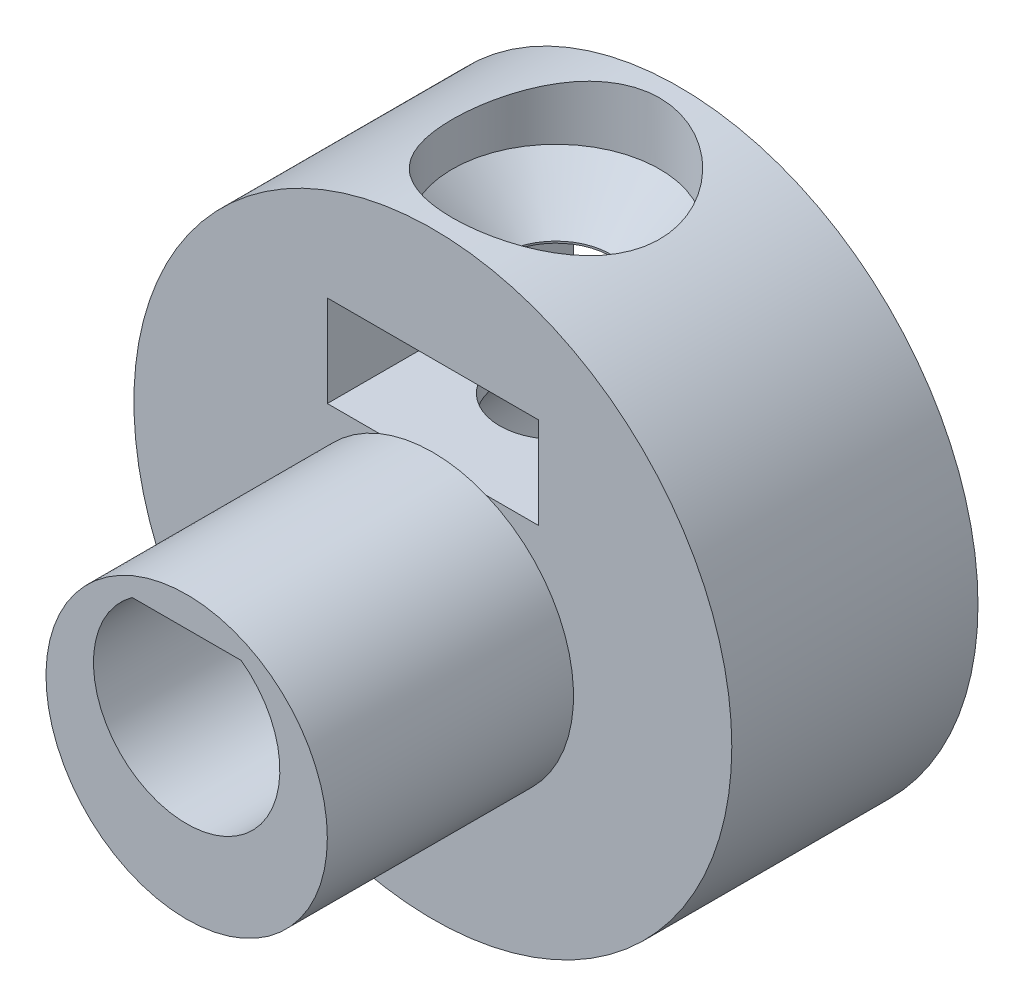
ISO-10303-21;
HEADER;
FILE_DESCRIPTION(('STEP AP214'),'2;1');
FILE_NAME('part.step','',(''),(''),'','','');
FILE_SCHEMA(('AUTOMOTIVE_DESIGN { 1 0 10303 214 1 1 1 1 }'));
ENDSEC;
DATA;
#1=APPLICATION_CONTEXT('core data for automotive mechanical design processes');
#2=APPLICATION_PROTOCOL_DEFINITION('international standard','automotive_design',2000,#1);
#3=PRODUCT_CONTEXT('',#1,'mechanical');
#4=PRODUCT('Part','Part','',(#3));
#5=PRODUCT_RELATED_PRODUCT_CATEGORY('part','',(#4));
#6=PRODUCT_DEFINITION_FORMATION('','',#4);
#7=PRODUCT_DEFINITION_CONTEXT('part definition',#1,'design');
#8=PRODUCT_DEFINITION('design','',#6,#7);
#9=PRODUCT_DEFINITION_SHAPE('','',#8);
#10=(LENGTH_UNIT() NAMED_UNIT(*) SI_UNIT(.MILLI.,.METRE.));
#11=(NAMED_UNIT(*) PLANE_ANGLE_UNIT() SI_UNIT($,.RADIAN.));
#12=(NAMED_UNIT(*) SI_UNIT($,.STERADIAN.) SOLID_ANGLE_UNIT());
#13=UNCERTAINTY_MEASURE_WITH_UNIT(LENGTH_MEASURE(1.E-05),#10,'distance_accuracy_value','');
#14=(GEOMETRIC_REPRESENTATION_CONTEXT(3) GLOBAL_UNCERTAINTY_ASSIGNED_CONTEXT((#13)) GLOBAL_UNIT_ASSIGNED_CONTEXT((#10,
#11,#12)) REPRESENTATION_CONTEXT('',''));
#15=CARTESIAN_POINT('',(0.,0.,0.));
#16=DIRECTION('',(0.,0.,1.));
#17=DIRECTION('',(1.,0.,0.));
#18=AXIS2_PLACEMENT_3D('',#15,#16,#17);
#19=CARTESIAN_POINT('',(0.,0.,7.));
#20=DIRECTION('',(0.,0.,-1.));
#21=DIRECTION('',(-1.,0.,0.));
#22=AXIS2_PLACEMENT_3D('',#19,#20,#21);
#23=CYLINDRICAL_SURFACE('',#22,8.5);
#24=CARTESIAN_POINT('',(0.,0.,7.));
#25=DIRECTION('',(0.,0.,1.));
#26=DIRECTION('',(1.,0.,0.));
#27=AXIS2_PLACEMENT_3D('',#24,#25,#26);
#28=CIRCLE('',#27,8.5);
#29=CARTESIAN_POINT('',(8.5,0.,7.));
#30=VERTEX_POINT('',#29);
#31=EDGE_CURVE('E272',#30,#30,#28,.T.);
#32=ORIENTED_EDGE('',*,*,#31,.F.);
#33=EDGE_LOOP('',(#32));
#34=FACE_BOUND('',#33,.T.);
#35=CARTESIAN_POINT('',(0.,0.,0.));
#36=DIRECTION('',(0.,0.,1.));
#37=DIRECTION('',(1.,0.,0.));
#38=AXIS2_PLACEMENT_3D('',#35,#36,#37);
#39=CIRCLE('',#38,8.5);
#40=CARTESIAN_POINT('',(8.5,0.,0.));
#41=VERTEX_POINT('',#40);
#42=EDGE_CURVE('E266',#41,#41,#39,.T.);
#43=ORIENTED_EDGE('',*,*,#42,.T.);
#44=EDGE_LOOP('',(#43));
#45=FACE_BOUND('',#44,.T.);
#46=CARTESIAN_POINT('',(-2.4976566133076,8.12475916209218,5.06978069869673));
#47=CARTESIAN_POINT('',(-2.45319115247167,8.13842624372445,5.14052214784692));
#48=CARTESIAN_POINT('',(-2.40579379129014,8.15259906685285,5.20926792787036));
#49=CARTESIAN_POINT('',(-2.30541918353998,8.18155142551015,5.34241791198123));
#50=CARTESIAN_POINT('',(-2.25244214730842,8.19633093815584,5.40682227957694));
#51=CARTESIAN_POINT('',(-2.08559993364935,8.24096387551114,5.59296340845329));
#52=CARTESIAN_POINT('',(-1.96379293821466,8.27112157248585,5.70767691704536));
#53=CARTESIAN_POINT('',(-1.70636003995567,8.32797463190604,5.91184711282402));
#54=CARTESIAN_POINT('',(-1.57128592838729,8.35474881482083,6.001981892767));
#55=CARTESIAN_POINT('',(-1.28750137103305,8.40315485018163,6.15915511575892));
#56=CARTESIAN_POINT('',(-1.13879895604352,8.42478970443847,6.22620705151039));
#57=CARTESIAN_POINT('',(-0.831187937836323,8.46068191069057,6.33519131239508));
#58=CARTESIAN_POINT('',(-0.672256571938539,8.47492212101672,6.37706530718806));
#59=CARTESIAN_POINT('',(-0.349104402202425,8.4943684291606,6.43385731899328));
#60=CARTESIAN_POINT('',(-0.184884583871302,8.49957620037078,6.44878032909372));
#61=CARTESIAN_POINT('',(0.138015723993134,8.50036011208845,6.45103621336103));
#62=CARTESIAN_POINT('',(0.296689734672785,8.4962657088658,6.43931282000832));
#63=CARTESIAN_POINT('',(0.609739891194811,8.47955195455849,6.39064304040091));
#64=CARTESIAN_POINT('',(0.764113634581695,8.46692793384153,6.35368283786199));
#65=CARTESIAN_POINT('',(1.06375533887611,8.4345186012922,6.25603150933245));
#66=CARTESIAN_POINT('',(1.20905000683216,8.41475557760322,6.19541419459285));
#67=CARTESIAN_POINT('',(1.48731375058839,8.37004774740902,6.0524065686952));
#68=CARTESIAN_POINT('',(1.62030956781964,8.34511458458429,5.97006507104002));
#69=CARTESIAN_POINT('',(1.77519124725063,8.31261821534849,5.85638504059988));
#70=CARTESIAN_POINT('',(1.8043222672237,8.30634083738567,5.83415379011479));
#71=CARTESIAN_POINT('',(1.96343933734412,8.27119610111673,5.70795471337644));
#72=CARTESIAN_POINT('',(2.08511950406867,8.24108270241644,5.59342954668651));
#73=CARTESIAN_POINT('',(2.30774596317545,8.1815459992705,5.34519120906915));
#74=CARTESIAN_POINT('',(2.40863639693148,8.15212473740542,5.2114279425932));
#75=CARTESIAN_POINT('',(2.58236776313032,8.09871823066431,4.93498995802956));
#76=CARTESIAN_POINT('',(2.65633004978303,8.07453878944836,4.79306002253415));
#77=CARTESIAN_POINT('',(2.7805092495441,8.03262664641585,4.49839769507062));
#78=CARTESIAN_POINT('',(2.83074936112862,8.01488765027596,4.34567602537025));
#79=CARTESIAN_POINT('',(2.90591996981457,7.98794413403531,4.03295557266693));
#80=CARTESIAN_POINT('',(2.9307875433104,7.97876083684202,3.87293972081594));
#81=CARTESIAN_POINT('',(2.95398174635075,7.97020434608399,3.55072336269741));
#82=CARTESIAN_POINT('',(2.95230970967962,7.97083065952385,3.38852296662646));
#83=CARTESIAN_POINT('',(2.92298994582522,7.98162544091318,3.07214390352963));
#84=CARTESIAN_POINT('',(2.89618320404268,7.9914849607523,2.91787537801917));
#85=CARTESIAN_POINT('',(2.81878881465332,8.01910824594589,2.61614548479724));
#86=CARTESIAN_POINT('',(2.76819372913322,8.03687448340477,2.46868626200185));
#87=CARTESIAN_POINT('',(2.64374182838853,8.07867559451911,2.18164089371048));
#88=CARTESIAN_POINT('',(2.56947203344734,8.10282034535183,2.04225083932772));
#89=CARTESIAN_POINT('',(2.4000811737298,8.15459461002143,1.77756977114323));
#90=CARTESIAN_POINT('',(2.30497218991925,8.18222210090779,1.65227065192168));
#91=CARTESIAN_POINT('',(2.14444672038787,8.22525010429297,1.47244158886466));
#92=CARTESIAN_POINT('',(2.08555070125962,8.24041673348502,1.41191270278541));
#93=CARTESIAN_POINT('',(1.96287977928872,8.27049513310864,1.29621000389169));
#94=CARTESIAN_POINT('',(1.89911464567286,8.28540734404793,1.24102594733433));
#95=CARTESIAN_POINT('',(1.83303027798234,8.3,1.18861513373476));
#96=B_SPLINE_CURVE_WITH_KNOTS('',3,(#46,#47,#48,#49,#50,#51,#52,#53,#54,#55,#56,#57,#58,#59,#60,
#61,#62,#63,#64,#65,#66,#67,#68,#69,#70,#71,#72,#73,#74,#75,#76,#77,#78,#79,#80,#81,#82,#83,#84,
#85,#86,#87,#88,#89,#90,#91,#92,#93,#94,#95),.UNSPECIFIED.,.F.,.F.,(4,2,2,2,2,2,2,2,2,2,2,2,2,2,
2,2,2,2,2,2,2,2,2,2,4),(0.,0.253833285787019,0.507657006239854,1.01513132403204,
1.50672343842426,1.99802771074243,2.49046585733758,2.98281276276087,3.4579950628208,
3.93343771763219,4.40740867898813,4.88032358222269,4.99186106409764,5.49853142231878,
6.00654586378571,6.48996962093975,6.9729196424049,7.45706448441352,7.94118499513888,
8.40966421544493,8.87829001289202,9.35558437726861,9.83260277159268,10.0897481621581,
10.3463905361852),.UNSPECIFIED.);
#97=CARTESIAN_POINT('',(-1.83303027798234,8.3,5.81138486626524));
#98=VERTEX_POINT('',#97);
#99=CARTESIAN_POINT('',(1.83303027798234,8.3,1.18861513373476));
#100=VERTEX_POINT('',#99);
#101=EDGE_CURVE('E187',#98,#100,#96,.T.);
#102=ORIENTED_EDGE('',*,*,#101,.F.);
#103=CARTESIAN_POINT('',(2.4976566133076,8.12475916209218,1.93021930130327));
#104=CARTESIAN_POINT('',(2.45318994500136,8.13842662563914,1.85947588226206));
#105=CARTESIAN_POINT('',(2.40579116119691,8.15259985847907,1.79072823574639));
#106=CARTESIAN_POINT('',(2.30541346555239,8.18155304169366,1.6575748509336));
#107=CARTESIAN_POINT('',(2.25243477065462,8.19633296846693,1.5931689439928));
#108=CARTESIAN_POINT('',(2.08559334134924,8.24096552582563,1.40703032681757));
#109=CARTESIAN_POINT('',(1.96378968996023,8.27112236826603,1.2923202912556));
#110=CARTESIAN_POINT('',(1.70636391719496,8.32797369967156,1.08815617097751));
#111=CARTESIAN_POINT('',(1.57129368992825,8.35474701933418,0.998023916349741));
#112=CARTESIAN_POINT('',(1.28751241618149,8.40315343701242,0.840849493137524));
#113=CARTESIAN_POINT('',(1.1388084928932,8.42478919827129,0.773795353021942));
#114=CARTESIAN_POINT('',(0.827987048637116,8.4610547714335,0.663675633520592));
#115=CARTESIAN_POINT('',(0.665639156561353,8.47551136360076,0.621199419975944));
#116=CARTESIAN_POINT('',(0.335522235240602,8.49498290962041,0.56436373105513));
#117=CARTESIAN_POINT('',(0.167753698153421,8.4999987181954,0.550001710352122));
#118=CARTESIAN_POINT('',(-0.160573090672336,8.50000122693764,0.549998362858586));
#119=CARTESIAN_POINT('',(-0.321132585567959,8.49540802765908,0.563153976514742));
#120=CARTESIAN_POINT('',(-0.637504919535551,8.47754145494676,0.615247090544994));
#121=CARTESIAN_POINT('',(-0.793317230736235,8.46426711985929,0.654187447232615));
#122=CARTESIAN_POINT('',(-1.10584501784713,8.42931993487434,0.759821744334155));
#123=CARTESIAN_POINT('',(-1.26194403527556,8.40715150324722,0.828174744399635));
#124=CARTESIAN_POINT('',(-1.55944141682563,8.35708973169379,0.990147520116793));
#125=CARTESIAN_POINT('',(-1.70083313076283,8.32919381878685,1.08377865754721));
#126=CARTESIAN_POINT('',(-1.96376574109255,8.27112897290653,1.29229244866549));
#127=CARTESIAN_POINT('',(-2.08550883931445,8.24098858276189,1.40692868073665));
#128=CARTESIAN_POINT('',(-2.30800118973862,8.1814676773007,1.65516964079898));
#129=CARTESIAN_POINT('',(-2.40875542862292,8.15208698294651,1.78876985048177));
#130=CARTESIAN_POINT('',(-2.58234889509949,8.09872513889258,2.06497202468677));
#131=CARTESIAN_POINT('',(-2.65628388776906,8.07455420965996,2.20684835983295));
#132=CARTESIAN_POINT('',(-2.78047378166719,8.03263878107992,2.50150025801988));
#133=CARTESIAN_POINT('',(-2.83073638027927,8.01489219321013,2.65427225956399));
#134=CARTESIAN_POINT('',(-2.90592304531664,7.98794314173254,2.96705492968833));
#135=CARTESIAN_POINT('',(-2.9307908841645,7.97875964189572,3.12708084544346));
#136=CARTESIAN_POINT('',(-2.95398136626459,7.9702044484857,3.44929719503748));
#137=CARTESIAN_POINT('',(-2.95230871741702,7.97083101474781,3.61148723989113));
#138=CARTESIAN_POINT('',(-2.92299011430598,7.98162538865863,3.92785476293909));
#139=CARTESIAN_POINT('',(-2.89618368313548,7.99148478657943,4.08212194506856));
#140=CARTESIAN_POINT('',(-2.81878968112678,8.01910794001413,4.38385194667557));
#141=CARTESIAN_POINT('',(-2.76819426046636,8.03687430454259,4.53131250247069));
#142=CARTESIAN_POINT('',(-2.6437418358828,8.07867559240639,4.81835909920957));
#143=CARTESIAN_POINT('',(-2.56947204541021,8.10282034150987,4.95774914059871));
#144=CARTESIAN_POINT('',(-2.40008118744198,8.1545946059138,5.22243020880838));
#145=CARTESIAN_POINT('',(-2.30497219775281,8.18222209879261,5.34772933892776));
#146=CARTESIAN_POINT('',(-2.14444664458044,8.22525012462106,5.52755849626095));
#147=CARTESIAN_POINT('',(-2.08555054227539,8.24041677442083,5.58808746070075));
#148=CARTESIAN_POINT('',(-1.96287960668323,8.27049517345836,5.70379014541685));
#149=CARTESIAN_POINT('',(-1.89911455609382,8.28540736381247,5.75897412356356));
#150=CARTESIAN_POINT('',(-1.83303027798234,8.3,5.81138486626524));
#151=B_SPLINE_CURVE_WITH_KNOTS('',3,(#103,#104,#105,#106,#107,#108,#109,#110,#111,#112,#113,
#114,#115,#116,#117,#118,#119,#120,#121,#122,#123,#124,#125,#126,#127,#128,#129,#130,#131,#132,
#133,#134,#135,#136,#137,#138,#139,#140,#141,#142,#143,#144,#145,#146,#147,#148,#149,#150),
.UNSPECIFIED.,.F.,.F.,(4,2,2,2,2,2,2,2,2,2,2,2,2,2,2,2,2,2,2,2,2,2,2,4),(0.,0.253840367119801,
0.50767086877788,1.01513136017837,1.50670724536165,1.99802774497997,2.50068775902432,
3.00330226248912,3.48440262049298,3.96555628146755,4.47840114630792,4.99147690469338,
5.49887966106123,6.00616172724637,6.48942722983445,6.97253548375081,7.45671110324845,
7.94080083792565,8.40927599969572,8.87790585615661,9.35520018446692,9.83221861486184,
10.0893643522644,10.3460063794543),.UNSPECIFIED.);
#152=EDGE_CURVE('E194',#100,#98,#151,.T.);
#153=ORIENTED_EDGE('',*,*,#152,.F.);
#154=EDGE_LOOP('',(#102,#153));
#155=FACE_BOUND('',#154,.T.);
#156=ADVANCED_FACE('F37',(#34,#45,#155),#23,.T.);
#157=CARTESIAN_POINT('',(0.,2.7,3.5));
#158=DIRECTION('',(0.,-1.,0.));
#159=DIRECTION('',(0.,0.,1.));
#160=AXIS2_PLACEMENT_3D('',#157,#158,#159);
#161=CONICAL_SURFACE('',#160,1.6,0.0174532925199433);
#162=CARTESIAN_POINT('',(0.,5.35146683778932,3.5));
#163=DIRECTION('',(0.,1.,0.));
#164=DIRECTION('',(0.,0.,1.));
#165=AXIS2_PLACEMENT_3D('',#162,#163,#164);
#166=CIRCLE('',#165,1.55371847419137);
#167=CARTESIAN_POINT('',(0.,5.35146683778932,5.05371847419137));
#168=VERTEX_POINT('',#167);
#169=EDGE_CURVE('E199',#168,#168,#166,.T.);
#170=ORIENTED_EDGE('',*,*,#169,.T.);
#171=EDGE_LOOP('',(#170));
#172=FACE_BOUND('',#171,.T.);
#173=CARTESIAN_POINT('',(0.,5.3,3.5));
#174=DIRECTION('',(0.,1.,0.));
#175=DIRECTION('',(0.,0.,1.));
#176=AXIS2_PLACEMENT_3D('',#173,#174,#175);
#177=CIRCLE('',#176,1.55461683118663);
#178=CARTESIAN_POINT('',(0.,5.3,5.05461683118663));
#179=VERTEX_POINT('',#178);
#180=EDGE_CURVE('E255',#179,#179,#177,.T.);
#181=ORIENTED_EDGE('',*,*,#180,.F.);
#182=EDGE_LOOP('',(#181));
#183=FACE_BOUND('',#182,.T.);
#184=ADVANCED_FACE('F184',(#172,#183),#161,.F.);
#185=CARTESIAN_POINT('',(0.,0.,7.));
#186=DIRECTION('',(0.,0.,1.));
#187=DIRECTION('',(1.,0.,0.));
#188=AXIS2_PLACEMENT_3D('',#185,#186,#187);
#189=PLANE('',#188);
#190=CARTESIAN_POINT('',(0.,-1.,7.));
#191=DIRECTION('',(0.,0.,1.));
#192=DIRECTION('',(1.,0.,0.));
#193=AXIS2_PLACEMENT_3D('',#190,#191,#192);
#194=CIRCLE('',#193,4.);
#195=CARTESIAN_POINT('',(-1.51986841535707,2.7,7.));
#196=VERTEX_POINT('',#195);
#197=CARTESIAN_POINT('',(1.51986841535707,2.7,7.));
#198=VERTEX_POINT('',#197);
#199=EDGE_CURVE('E11',#196,#198,#194,.T.);
#200=ORIENTED_EDGE('',*,*,#199,.F.);
#201=DIRECTION('',(-1.,0.,0.));
#202=VECTOR('',#201,1.);
#203=CARTESIAN_POINT('',(3.,2.7,7.));
#204=LINE('',#203,#202);
#205=CARTESIAN_POINT('',(-3.,2.7,7.));
#206=VERTEX_POINT('',#205);
#207=EDGE_CURVE('E410',#196,#206,#204,.T.);
#208=ORIENTED_EDGE('',*,*,#207,.T.);
#209=DIRECTION('',(0.,1.,0.));
#210=VECTOR('',#209,1.);
#211=CARTESIAN_POINT('',(-3.,2.7,7.));
#212=LINE('',#211,#210);
#213=CARTESIAN_POINT('',(-3.,5.3,7.));
#214=VERTEX_POINT('',#213);
#215=EDGE_CURVE('E246',#206,#214,#212,.T.);
#216=ORIENTED_EDGE('',*,*,#215,.T.);
#217=DIRECTION('',(1.,0.,0.));
#218=VECTOR('',#217,1.);
#219=CARTESIAN_POINT('',(3.,5.3,7.));
#220=LINE('',#219,#218);
#221=CARTESIAN_POINT('',(3.,5.3,7.));
#222=VERTEX_POINT('',#221);
#223=EDGE_CURVE('E406',#214,#222,#220,.T.);
#224=ORIENTED_EDGE('',*,*,#223,.T.);
#225=DIRECTION('',(0.,-1.,0.));
#226=VECTOR('',#225,1.);
#227=CARTESIAN_POINT('',(3.,2.7,7.));
#228=LINE('',#227,#226);
#229=CARTESIAN_POINT('',(3.,2.7,7.));
#230=VERTEX_POINT('',#229);
#231=EDGE_CURVE('E408',#222,#230,#228,.T.);
#232=ORIENTED_EDGE('',*,*,#231,.T.);
#233=EDGE_CURVE('E261',#230,#198,#204,.T.);
#234=ORIENTED_EDGE('',*,*,#233,.T.);
#235=EDGE_LOOP('',(#200,#208,#216,#224,#232,#234));
#236=FACE_BOUND('',#235,.T.);
#237=ORIENTED_EDGE('',*,*,#31,.T.);
#238=EDGE_LOOP('',(#237));
#239=FACE_BOUND('',#238,.T.);
#240=ADVANCED_FACE('F209',(#236,#239),#189,.T.);
#241=CARTESIAN_POINT('',(0.,0.,0.));
#242=DIRECTION('',(0.,0.,1.));
#243=DIRECTION('',(1.,0.,0.));
#244=AXIS2_PLACEMENT_3D('',#241,#242,#243);
#245=PLANE('',#244);
#246=DIRECTION('',(1.,0.,0.));
#247=VECTOR('',#246,1.);
#248=CARTESIAN_POINT('',(1.54919333848297,2.15,0.));
#249=LINE('',#248,#247);
#250=CARTESIAN_POINT('',(-1.54919333848297,2.15,0.));
#251=VERTEX_POINT('',#250);
#252=CARTESIAN_POINT('',(1.54919333848297,2.15,0.));
#253=VERTEX_POINT('',#252);
#254=EDGE_CURVE('E137',#251,#253,#249,.T.);
#255=ORIENTED_EDGE('',*,*,#254,.F.);
#256=CARTESIAN_POINT('',(0.,0.,0.));
#257=DIRECTION('',(0.,0.,-1.));
#258=DIRECTION('',(-1.,0.,0.));
#259=AXIS2_PLACEMENT_3D('',#256,#257,#258);
#260=CIRCLE('',#259,2.65);
#261=EDGE_CURVE('E55',#253,#251,#260,.T.);
#262=ORIENTED_EDGE('',*,*,#261,.F.);
#263=EDGE_LOOP('',(#255,#262));
#264=FACE_BOUND('',#263,.T.);
#265=DIRECTION('',(1.,0.,0.));
#266=VECTOR('',#265,1.);
#267=CARTESIAN_POINT('',(3.,5.3,0.));
#268=LINE('',#267,#266);
#269=CARTESIAN_POINT('',(-3.,5.3,0.));
#270=VERTEX_POINT('',#269);
#271=CARTESIAN_POINT('',(3.,5.3,0.));
#272=VERTEX_POINT('',#271);
#273=EDGE_CURVE('E253',#270,#272,#268,.T.);
#274=ORIENTED_EDGE('',*,*,#273,.F.);
#275=DIRECTION('',(0.,1.,0.));
#276=VECTOR('',#275,1.);
#277=CARTESIAN_POINT('',(-3.,2.7,0.));
#278=LINE('',#277,#276);
#279=CARTESIAN_POINT('',(-3.,2.7,0.));
#280=VERTEX_POINT('',#279);
#281=EDGE_CURVE('E250',#280,#270,#278,.T.);
#282=ORIENTED_EDGE('',*,*,#281,.F.);
#283=DIRECTION('',(-1.,0.,0.));
#284=VECTOR('',#283,1.);
#285=CARTESIAN_POINT('',(3.,2.7,0.));
#286=LINE('',#285,#284);
#287=CARTESIAN_POINT('',(3.,2.7,0.));
#288=VERTEX_POINT('',#287);
#289=EDGE_CURVE('E236',#288,#280,#286,.T.);
#290=ORIENTED_EDGE('',*,*,#289,.F.);
#291=DIRECTION('',(0.,-1.,0.));
#292=VECTOR('',#291,1.);
#293=CARTESIAN_POINT('',(3.,2.7,0.));
#294=LINE('',#293,#292);
#295=EDGE_CURVE('E247',#272,#288,#294,.T.);
#296=ORIENTED_EDGE('',*,*,#295,.F.);
#297=EDGE_LOOP('',(#274,#282,#290,#296));
#298=FACE_BOUND('',#297,.T.);
#299=ORIENTED_EDGE('',*,*,#42,.F.);
#300=EDGE_LOOP('',(#299));
#301=FACE_BOUND('',#300,.T.);
#302=ADVANCED_FACE('F204',(#264,#298,#301),#245,.F.);
#303=CARTESIAN_POINT('',(-3.,2.7,7.));
#304=DIRECTION('',(-1.,0.,0.));
#305=DIRECTION('',(0.,0.,1.));
#306=AXIS2_PLACEMENT_3D('',#303,#304,#305);
#307=PLANE('',#306);
#308=ORIENTED_EDGE('',*,*,#281,.T.);
#309=DIRECTION('',(0.,0.,-1.));
#310=VECTOR('',#309,1.);
#311=CARTESIAN_POINT('',(-3.,5.3,7.));
#312=LINE('',#311,#310);
#313=EDGE_CURVE('E270',#214,#270,#312,.T.);
#314=ORIENTED_EDGE('',*,*,#313,.F.);
#315=ORIENTED_EDGE('',*,*,#215,.F.);
#316=DIRECTION('',(0.,0.,-1.));
#317=VECTOR('',#316,1.);
#318=CARTESIAN_POINT('',(-3.,2.7,7.));
#319=LINE('',#318,#317);
#320=EDGE_CURVE('E239',#206,#280,#319,.T.);
#321=ORIENTED_EDGE('',*,*,#320,.T.);
#322=EDGE_LOOP('',(#308,#314,#315,#321));
#323=FACE_BOUND('',#322,.T.);
#324=ADVANCED_FACE('F208',(#323),#307,.F.);
#325=CARTESIAN_POINT('',(3.,2.7,7.));
#326=DIRECTION('',(0.,-1.,0.));
#327=DIRECTION('',(0.,0.,-1.));
#328=AXIS2_PLACEMENT_3D('',#325,#326,#327);
#329=PLANE('',#328);
#330=CARTESIAN_POINT('',(0.,2.7,3.5));
#331=DIRECTION('',(0.,1.,0.));
#332=DIRECTION('',(0.,0.,1.));
#333=AXIS2_PLACEMENT_3D('',#330,#331,#332);
#334=CIRCLE('',#333,1.6);
#335=CARTESIAN_POINT('',(0.,2.7,5.1));
#336=VERTEX_POINT('',#335);
#337=EDGE_CURVE('E232',#336,#336,#334,.T.);
#338=ORIENTED_EDGE('',*,*,#337,.F.);
#339=EDGE_LOOP('',(#338));
#340=FACE_BOUND('',#339,.T.);
#341=ORIENTED_EDGE('',*,*,#289,.T.);
#342=ORIENTED_EDGE('',*,*,#320,.F.);
#343=ORIENTED_EDGE('',*,*,#207,.F.);
#344=EDGE_CURVE('E411',#198,#196,#204,.T.);
#345=ORIENTED_EDGE('',*,*,#344,.F.);
#346=ORIENTED_EDGE('',*,*,#233,.F.);
#347=DIRECTION('',(0.,0.,-1.));
#348=VECTOR('',#347,1.);
#349=CARTESIAN_POINT('',(3.,2.7,7.));
#350=LINE('',#349,#348);
#351=EDGE_CURVE('E242',#230,#288,#350,.T.);
#352=ORIENTED_EDGE('',*,*,#351,.T.);
#353=EDGE_LOOP('',(#341,#342,#343,#345,#346,#352));
#354=FACE_BOUND('',#353,.T.);
#355=ADVANCED_FACE('F216',(#340,#354),#329,.F.);
#356=CARTESIAN_POINT('',(3.,2.7,7.));
#357=DIRECTION('',(1.,0.,0.));
#358=DIRECTION('',(0.,0.,-1.));
#359=AXIS2_PLACEMENT_3D('',#356,#357,#358);
#360=PLANE('',#359);
#361=ORIENTED_EDGE('',*,*,#295,.T.);
#362=ORIENTED_EDGE('',*,*,#351,.F.);
#363=ORIENTED_EDGE('',*,*,#231,.F.);
#364=DIRECTION('',(0.,0.,-1.));
#365=VECTOR('',#364,1.);
#366=CARTESIAN_POINT('',(3.,5.3,7.));
#367=LINE('',#366,#365);
#368=EDGE_CURVE('E268',#222,#272,#367,.T.);
#369=ORIENTED_EDGE('',*,*,#368,.T.);
#370=EDGE_LOOP('',(#361,#362,#363,#369));
#371=FACE_BOUND('',#370,.T.);
#372=ADVANCED_FACE('F221',(#371),#360,.F.);
#373=CARTESIAN_POINT('',(3.,5.3,7.));
#374=DIRECTION('',(0.,1.,0.));
#375=DIRECTION('',(0.,0.,1.));
#376=AXIS2_PLACEMENT_3D('',#373,#374,#375);
#377=PLANE('',#376);
#378=ORIENTED_EDGE('',*,*,#180,.T.);
#379=EDGE_LOOP('',(#378));
#380=FACE_BOUND('',#379,.T.);
#381=ORIENTED_EDGE('',*,*,#273,.T.);
#382=ORIENTED_EDGE('',*,*,#368,.F.);
#383=ORIENTED_EDGE('',*,*,#223,.F.);
#384=ORIENTED_EDGE('',*,*,#313,.T.);
#385=EDGE_LOOP('',(#381,#382,#383,#384));
#386=FACE_BOUND('',#385,.T.);
#387=ADVANCED_FACE('F218',(#380,#386),#377,.F.);
#388=CARTESIAN_POINT('',(0.,2.7,3.5));
#389=DIRECTION('',(0.,1.,0.));
#390=DIRECTION('',(0.,0.,1.));
#391=AXIS2_PLACEMENT_3D('',#388,#389,#390);
#392=CONICAL_SURFACE('',#391,1.6,0.0174532925199433);
#393=CARTESIAN_POINT('',(-1.00549557480747,2.45183169264177,4.73900592127049));
#394=CARTESIAN_POINT('',(-1.04114906063982,2.43721135745625,4.70973492411046));
#395=CARTESIAN_POINT('',(-1.07542625410772,2.42224402908244,4.67901298512249));
#396=CARTESIAN_POINT('',(-1.14113413618689,2.3919911165622,4.61478896234473));
#397=CARTESIAN_POINT('',(-1.17256416605369,2.37670545976558,4.58128623858694));
#398=CARTESIAN_POINT('',(-1.26270371489511,2.33080024736449,4.47647961952857));
#399=CARTESIAN_POINT('',(-1.3169213793621,2.30027878291521,4.40115812157085));
#400=CARTESIAN_POINT('',(-1.40629379304243,2.24660375824557,4.25085287167676));
#401=CARTESIAN_POINT('',(-1.44295733493256,2.22300554787248,4.17691904176447));
#402=CARTESIAN_POINT('',(-1.50480606414261,2.18161599156685,4.02299630739797));
#403=CARTESIAN_POINT('',(-1.53002196404735,2.16380914501963,3.94302428393103));
#404=CARTESIAN_POINT('',(-1.56538722996714,2.13833561803012,3.78928784099944));
#405=CARTESIAN_POINT('',(-1.57705374091451,2.12966159914898,3.7160420403303));
#406=CARTESIAN_POINT('',(-1.59014005884272,2.11991289887216,3.56815841155053));
#407=CARTESIAN_POINT('',(-1.59157084202674,2.11883007714015,3.49352216064572));
#408=CARTESIAN_POINT('',(-1.58548333059455,2.12337948339012,3.37193606875479));
#409=CARTESIAN_POINT('',(-1.58100764763395,2.12672985034913,3.32471299614241));
#410=CARTESIAN_POINT('',(-1.56798037685201,2.13635288799468,3.23114685616058));
#411=CARTESIAN_POINT('',(-1.55942919035661,2.14262527094097,3.18480370261023));
#412=CARTESIAN_POINT('',(-1.52879158791388,2.16469903940939,3.05164292920928));
#413=CARTESIAN_POINT('',(-1.50147787835819,2.18396975180046,2.96655242033379));
#414=CARTESIAN_POINT('',(-1.43395728016035,2.228877436446,2.80330921314797));
#415=CARTESIAN_POINT('',(-1.39370771912562,2.25453541476779,2.72518058550496));
#416=CARTESIAN_POINT('',(-1.30194872073587,2.30873494744538,2.57771103157382));
#417=CARTESIAN_POINT('',(-1.25050699034981,2.33725863013626,2.50832106290542));
#418=CARTESIAN_POINT('',(-1.13729649217,2.39437899722569,2.37889254633403));
#419=CARTESIAN_POINT('',(-1.07555521978666,2.42297529276594,2.31882990155459));
#420=CARTESIAN_POINT('',(-0.973645329723348,2.46495538640708,2.23468821152848));
#421=CARTESIAN_POINT('',(-0.936852338139143,2.47921167114098,2.20689545209238));
#422=CARTESIAN_POINT('',(-0.898791632785118,2.49292470821633,2.18067432943348));
#423=B_SPLINE_CURVE_WITH_KNOTS('',3,(#393,#394,#395,#396,#397,#398,#399,#400,#401,#402,#403,
#404,#405,#406,#407,#408,#409,#410,#411,#412,#413,#414,#415,#416,#417,#418,#419,#420,#421,#422),
.UNSPECIFIED.,.F.,.F.,(4,2,2,2,2,2,2,2,2,2,2,2,2,2,4),(0.,0.145071479904694,0.290176439531789,
0.581766707980872,0.838270578911275,1.09408215532818,1.31709735954096,1.53987337923491,
1.68227071544396,1.82465403229528,2.09719464809532,2.37064370291009,2.6424823768656,
2.91360664134894,3.05822890437435),.UNSPECIFIED.);
#424=CARTESIAN_POINT('',(-1.54919333848297,2.15,3.85968215303523));
#425=VERTEX_POINT('',#424);
#426=CARTESIAN_POINT('',(-1.54919333848297,2.15,3.14031784696477));
#427=VERTEX_POINT('',#426);
#428=EDGE_CURVE('E124',#425,#427,#423,.T.);
#429=ORIENTED_EDGE('',*,*,#428,.T.);
#430=CARTESIAN_POINT('',(0.,2.15,3.5));
#431=DIRECTION('',(0.,1.,0.));
#432=DIRECTION('',(0.,0.,1.));
#433=AXIS2_PLACEMENT_3D('',#430,#431,#432);
#434=CIRCLE('',#433,1.59039971428948);
#435=CARTESIAN_POINT('',(1.54919333848297,2.15,3.14031784696477));
#436=VERTEX_POINT('',#435);
#437=EDGE_CURVE('E146',#427,#436,#434,.F.);
#438=ORIENTED_EDGE('',*,*,#437,.T.);
#439=CARTESIAN_POINT('',(0.898791632785026,2.49292470821636,2.18067432943361));
#440=CARTESIAN_POINT('',(0.936667174091869,2.47927051213931,2.20677179469448));
#441=CARTESIAN_POINT('',(0.973259453225839,2.46510033526094,2.23439898301896));
#442=CARTESIAN_POINT('',(1.04376767374676,2.43608335542143,2.29255564674331));
#443=CARTESIAN_POINT('',(1.0776838577636,2.42123661399444,2.32308485847476));
#444=CARTESIAN_POINT('',(1.17557016100806,2.37606906609189,2.41909811560865));
#445=CARTESIAN_POINT('',(1.23531890598578,2.34525629207016,2.4887590093276));
#446=CARTESIAN_POINT('',(1.33688746965532,2.28872592187343,2.63016587750862));
#447=CARTESIAN_POINT('',(1.37991409141054,2.26280912711403,2.70097533368797));
#448=CARTESIAN_POINT('',(1.45482090488903,2.21539112527075,2.84934873596978));
#449=CARTESIAN_POINT('',(1.48675047057393,2.19387053930524,2.92688079366915));
#450=CARTESIAN_POINT('',(1.52649078444639,2.16624330525176,3.05036293822033));
#451=CARTESIAN_POINT('',(1.53863568873332,2.15760350544296,3.09440326356597));
#452=CARTESIAN_POINT('',(1.56535931442556,2.13835763176975,3.21061831708121));
#453=CARTESIAN_POINT('',(1.57703147188091,2.12967844576872,3.28382997857632));
#454=CARTESIAN_POINT('',(1.59014126030158,2.11991175720869,3.43173189427637));
#455=CARTESIAN_POINT('',(1.59157347829999,2.11882826984196,3.5064229095725));
#456=CARTESIAN_POINT('',(1.58548214395148,2.12338026611942,3.6280890862294));
#457=CARTESIAN_POINT('',(1.58100449371541,2.12673176428264,3.6753374605698));
#458=CARTESIAN_POINT('',(1.56796810410584,2.13636236712984,3.7689134900266));
#459=CARTESIAN_POINT('',(1.55941459571286,2.1426377190938,3.8152422462226));
#460=CARTESIAN_POINT('',(1.54094020654753,2.1559447387288,3.89556858875685));
#461=CARTESIAN_POINT('',(1.53184205614671,2.16243213657927,3.92985371489501));
#462=CARTESIAN_POINT('',(1.50043301899892,2.18446260403059,4.03423185275902));
#463=CARTESIAN_POINT('',(1.47449693940168,2.20219390749595,4.10281478191649));
#464=CARTESIAN_POINT('',(1.41400483611516,2.24151597205148,4.23509657756863));
#465=CARTESIAN_POINT('',(1.37941774580058,2.26312056153268,4.29877673587795));
#466=CARTESIAN_POINT('',(1.29526821667221,2.3124797150711,4.43164032556896));
#467=CARTESIAN_POINT('',(1.24412065574424,2.34063391387645,4.49967528139335));
#468=CARTESIAN_POINT('',(1.13196937923128,2.39689663997294,4.62643012728681));
#469=CARTESIAN_POINT('',(1.07101505130892,2.42500471808072,4.68519391445854));
#470=CARTESIAN_POINT('',(1.00549557480747,2.45183169264177,4.73900592127049));
#471=B_SPLINE_CURVE_WITH_KNOTS('',3,(#439,#440,#441,#442,#443,#444,#445,#446,#447,#448,#449,
#450,#451,#452,#453,#454,#455,#456,#457,#458,#459,#460,#461,#462,#463,#464,#465,#466,#467,#468,
#469,#470),.UNSPECIFIED.,.F.,.F.,(4,2,2,2,2,2,2,2,2,2,2,2,2,2,2,4),(0.,0.143833004570379,
0.287652953408443,0.576648544720374,0.836182761295904,1.09454699171719,1.23385804067958,
1.45669474324779,1.67964923152965,1.82213074054759,1.96442987844758,2.07252839770362,
2.29791473700063,2.52412238271167,2.7920167906323,3.05860202213607),.UNSPECIFIED.);
#472=CARTESIAN_POINT('',(1.54919333848297,2.15,3.85968215303523));
#473=VERTEX_POINT('',#472);
#474=EDGE_CURVE('E154',#436,#473,#471,.T.);
#475=ORIENTED_EDGE('',*,*,#474,.T.);
#476=EDGE_CURVE('E143',#473,#425,#434,.F.);
#477=ORIENTED_EDGE('',*,*,#476,.T.);
#478=EDGE_LOOP('',(#429,#438,#475,#477));
#479=FACE_BOUND('',#478,.T.);
#480=ORIENTED_EDGE('',*,*,#337,.T.);
#481=EDGE_LOOP('',(#480));
#482=FACE_BOUND('',#481,.T.);
#483=ADVANCED_FACE('F160',(#479,#482),#392,.F.);
#484=CARTESIAN_POINT('',(0.,8.5,3.5));
#485=DIRECTION('',(0.,-1.,0.));
#486=DIRECTION('',(0.,0.,-1.));
#487=AXIS2_PLACEMENT_3D('',#484,#485,#486);
#488=CYLINDRICAL_SURFACE('',#487,2.95);
#489=ORIENTED_EDGE('',*,*,#101,.T.);
#490=ORIENTED_EDGE('',*,*,#152,.T.);
#491=EDGE_LOOP('',(#489,#490));
#492=FACE_BOUND('',#491,.T.);
#493=CARTESIAN_POINT('',(0.,6.74774836359798,3.5));
#494=DIRECTION('',(0.,1.,0.));
#495=DIRECTION('',(0.,0.,1.));
#496=AXIS2_PLACEMENT_3D('',#493,#494,#495);
#497=CIRCLE('',#496,2.95);
#498=CARTESIAN_POINT('',(0.,6.74774836359798,6.45));
#499=VERTEX_POINT('',#498);
#500=EDGE_CURVE('E42',#499,#499,#497,.F.);
#501=ORIENTED_EDGE('',*,*,#500,.T.);
#502=EDGE_LOOP('',(#501));
#503=FACE_BOUND('',#502,.T.);
#504=ADVANCED_FACE('F180',(#492,#503),#488,.F.);
#505=CARTESIAN_POINT('',(0.,5.35146683778934,3.5));
#506=DIRECTION('',(0.,1.,0.));
#507=DIRECTION('',(0.,0.,1.));
#508=AXIS2_PLACEMENT_3D('',#505,#506,#507);
#509=CONICAL_SURFACE('',#508,1.55371847419137,0.785398163397443);
#510=ORIENTED_EDGE('',*,*,#500,.F.);
#511=EDGE_LOOP('',(#510));
#512=FACE_BOUND('',#511,.T.);
#513=ORIENTED_EDGE('',*,*,#169,.F.);
#514=EDGE_LOOP('',(#513));
#515=FACE_BOUND('',#514,.T.);
#516=ADVANCED_FACE('F40',(#512,#515),#509,.F.);
#517=CARTESIAN_POINT('',(0.,-1.,7.));
#518=DIRECTION('',(0.,0.,1.));
#519=DIRECTION('',(1.,0.,0.));
#520=AXIS2_PLACEMENT_3D('',#517,#518,#519);
#521=PLANE('',#520);
#522=EDGE_CURVE('E48',#198,#196,#194,.T.);
#523=ORIENTED_EDGE('',*,*,#522,.F.);
#524=ORIENTED_EDGE('',*,*,#344,.T.);
#525=EDGE_LOOP('',(#523,#524));
#526=FACE_BOUND('',#525,.T.);
#527=ADVANCED_FACE('F173',(#526),#521,.F.);
#528=CARTESIAN_POINT('',(0.,-1.,14.));
#529=DIRECTION('',(0.,0.,-1.));
#530=DIRECTION('',(-1.,0.,0.));
#531=AXIS2_PLACEMENT_3D('',#528,#529,#530);
#532=CYLINDRICAL_SURFACE('',#531,4.);
#533=CARTESIAN_POINT('',(0.,-1.,14.));
#534=DIRECTION('',(0.,0.,1.));
#535=DIRECTION('',(1.,0.,0.));
#536=AXIS2_PLACEMENT_3D('',#533,#534,#535);
#537=CIRCLE('',#536,4.);
#538=CARTESIAN_POINT('',(4.,-1.,14.));
#539=VERTEX_POINT('',#538);
#540=EDGE_CURVE('E400',#539,#539,#537,.T.);
#541=ORIENTED_EDGE('',*,*,#540,.F.);
#542=EDGE_LOOP('',(#541));
#543=FACE_BOUND('',#542,.T.);
#544=ORIENTED_EDGE('',*,*,#522,.T.);
#545=ORIENTED_EDGE('',*,*,#199,.T.);
#546=EDGE_LOOP('',(#544,#545));
#547=FACE_BOUND('',#546,.T.);
#548=ADVANCED_FACE('F172',(#543,#547),#532,.T.);
#549=CARTESIAN_POINT('',(0.,-1.,14.));
#550=DIRECTION('',(0.,0.,1.));
#551=DIRECTION('',(1.,0.,0.));
#552=AXIS2_PLACEMENT_3D('',#549,#550,#551);
#553=PLANE('',#552);
#554=CARTESIAN_POINT('',(0.,0.,14.));
#555=DIRECTION('',(0.,0.,-1.));
#556=DIRECTION('',(-1.,0.,0.));
#557=AXIS2_PLACEMENT_3D('',#554,#555,#556);
#558=CIRCLE('',#557,2.65);
#559=CARTESIAN_POINT('',(1.54919333848297,2.15,14.));
#560=VERTEX_POINT('',#559);
#561=CARTESIAN_POINT('',(-1.54919333848297,2.15,14.));
#562=VERTEX_POINT('',#561);
#563=EDGE_CURVE('E121',#560,#562,#558,.T.);
#564=ORIENTED_EDGE('',*,*,#563,.T.);
#565=DIRECTION('',(1.,0.,0.));
#566=VECTOR('',#565,1.);
#567=CARTESIAN_POINT('',(1.54919333848297,2.15,14.));
#568=LINE('',#567,#566);
#569=EDGE_CURVE('E130',#562,#560,#568,.T.);
#570=ORIENTED_EDGE('',*,*,#569,.T.);
#571=EDGE_LOOP('',(#564,#570));
#572=FACE_BOUND('',#571,.T.);
#573=ORIENTED_EDGE('',*,*,#540,.T.);
#574=EDGE_LOOP('',(#573));
#575=FACE_BOUND('',#574,.T.);
#576=ADVANCED_FACE('F135',(#572,#575),#553,.T.);
#577=CARTESIAN_POINT('',(0.,0.,14.));
#578=DIRECTION('',(0.,0.,-1.));
#579=DIRECTION('',(-1.,0.,0.));
#580=AXIS2_PLACEMENT_3D('',#577,#578,#579);
#581=CYLINDRICAL_SURFACE('',#580,2.65);
#582=DIRECTION('',(0.,0.,-1.));
#583=VECTOR('',#582,1.);
#584=CARTESIAN_POINT('',(1.54919333848297,2.15,14.));
#585=LINE('',#584,#583);
#586=EDGE_CURVE('E126',#436,#253,#585,.T.);
#587=ORIENTED_EDGE('',*,*,#586,.T.);
#588=ORIENTED_EDGE('',*,*,#261,.T.);
#589=DIRECTION('',(0.,0.,-1.));
#590=VECTOR('',#589,1.);
#591=CARTESIAN_POINT('',(-1.54919333848297,2.15,14.));
#592=LINE('',#591,#590);
#593=EDGE_CURVE('E127',#427,#251,#592,.T.);
#594=ORIENTED_EDGE('',*,*,#593,.F.);
#595=ORIENTED_EDGE('',*,*,#428,.F.);
#596=EDGE_CURVE('E63',#562,#425,#592,.T.);
#597=ORIENTED_EDGE('',*,*,#596,.F.);
#598=ORIENTED_EDGE('',*,*,#563,.F.);
#599=EDGE_CURVE('E132',#560,#473,#585,.T.);
#600=ORIENTED_EDGE('',*,*,#599,.T.);
#601=ORIENTED_EDGE('',*,*,#474,.F.);
#602=EDGE_LOOP('',(#587,#588,#594,#595,#597,#598,#600,#601));
#603=FACE_BOUND('',#602,.T.);
#604=ADVANCED_FACE('F118',(#603),#581,.F.);
#605=CARTESIAN_POINT('',(1.54919333848297,2.15,14.));
#606=DIRECTION('',(0.,1.,0.));
#607=DIRECTION('',(0.,0.,1.));
#608=AXIS2_PLACEMENT_3D('',#605,#606,#607);
#609=PLANE('',#608);
#610=ORIENTED_EDGE('',*,*,#593,.T.);
#611=ORIENTED_EDGE('',*,*,#254,.T.);
#612=ORIENTED_EDGE('',*,*,#586,.F.);
#613=ORIENTED_EDGE('',*,*,#437,.F.);
#614=EDGE_LOOP('',(#610,#611,#612,#613));
#615=FACE_BOUND('',#614,.T.);
#616=ADVANCED_FACE('F168',(#615),#609,.F.);
#617=ORIENTED_EDGE('',*,*,#599,.F.);
#618=ORIENTED_EDGE('',*,*,#569,.F.);
#619=ORIENTED_EDGE('',*,*,#596,.T.);
#620=ORIENTED_EDGE('',*,*,#476,.F.);
#621=EDGE_LOOP('',(#617,#618,#619,#620));
#622=FACE_BOUND('',#621,.T.);
#623=ADVANCED_FACE('F131',(#622),#609,.F.);
#624=CLOSED_SHELL('',(#156,#184,#240,#302,#324,#355,#372,#387,#483,#504,#516,#527,#548,#576,
#604,#616,#623));
#625=MANIFOLD_SOLID_BREP('B2',#624);
#626=ADVANCED_BREP_SHAPE_REPRESENTATION('',(#18,#625),#14);
#627=SHAPE_DEFINITION_REPRESENTATION(#9,#626);
ENDSEC;
END-ISO-10303-21;
